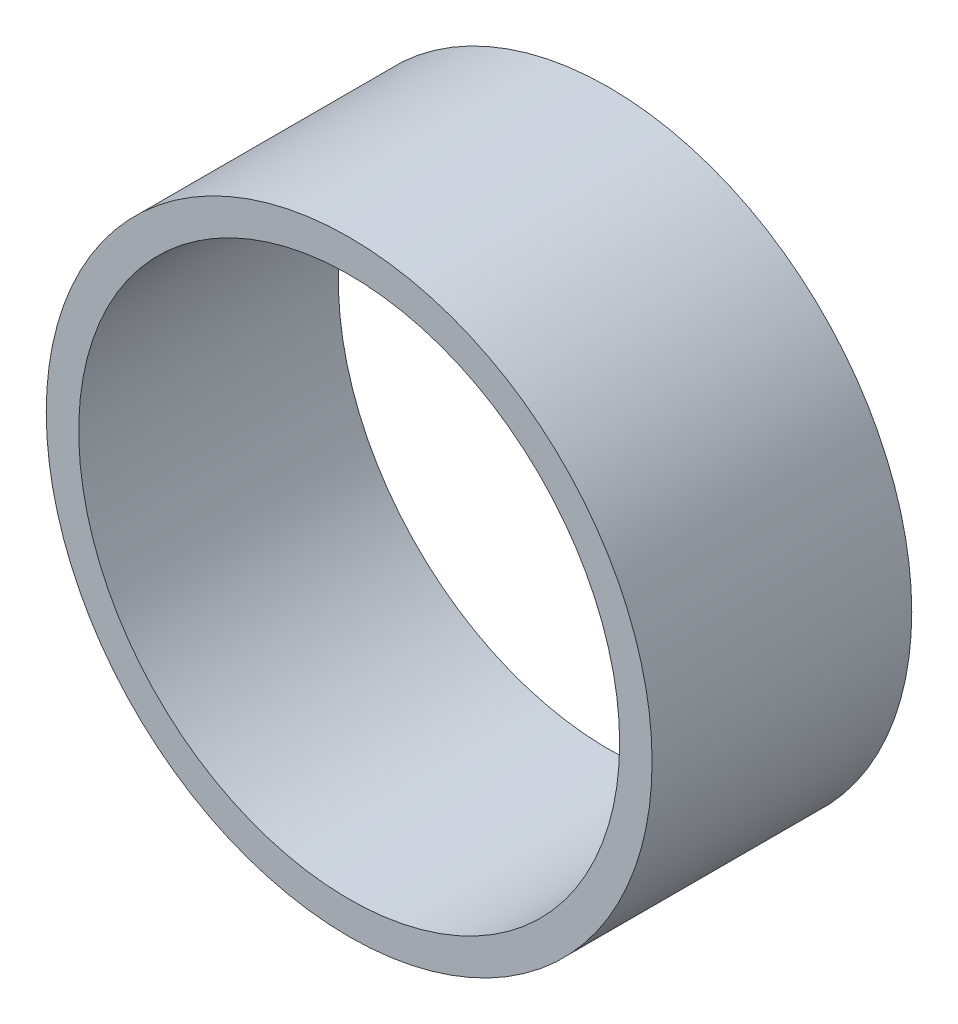
ISO-10303-21;
HEADER;
FILE_DESCRIPTION(('STEP AP214'),'2;1');
FILE_NAME('part.step','',(''),(''),'','','');
FILE_SCHEMA(('AUTOMOTIVE_DESIGN { 1 0 10303 214 1 1 1 1 }'));
ENDSEC;
DATA;
#1=APPLICATION_CONTEXT('core data for automotive mechanical design processes');
#2=APPLICATION_PROTOCOL_DEFINITION('international standard','automotive_design',2000,#1);
#3=PRODUCT_CONTEXT('',#1,'mechanical');
#4=PRODUCT('Part','Part','',(#3));
#5=PRODUCT_RELATED_PRODUCT_CATEGORY('part','',(#4));
#6=PRODUCT_DEFINITION_FORMATION('','',#4);
#7=PRODUCT_DEFINITION_CONTEXT('part definition',#1,'design');
#8=PRODUCT_DEFINITION('design','',#6,#7);
#9=PRODUCT_DEFINITION_SHAPE('','',#8);
#10=(LENGTH_UNIT() NAMED_UNIT(*) SI_UNIT(.MILLI.,.METRE.));
#11=(NAMED_UNIT(*) PLANE_ANGLE_UNIT() SI_UNIT($,.RADIAN.));
#12=(NAMED_UNIT(*) SI_UNIT($,.STERADIAN.) SOLID_ANGLE_UNIT());
#13=UNCERTAINTY_MEASURE_WITH_UNIT(LENGTH_MEASURE(1.E-05),#10,'distance_accuracy_value','');
#14=(GEOMETRIC_REPRESENTATION_CONTEXT(3) GLOBAL_UNCERTAINTY_ASSIGNED_CONTEXT((#13)) GLOBAL_UNIT_ASSIGNED_CONTEXT((#10,
#11,#12)) REPRESENTATION_CONTEXT('',''));
#15=CARTESIAN_POINT('',(0.,0.,0.));
#16=DIRECTION('',(0.,0.,1.));
#17=DIRECTION('',(1.,0.,0.));
#18=AXIS2_PLACEMENT_3D('',#15,#16,#17);
#19=CARTESIAN_POINT('',(0.,0.,12.));
#20=DIRECTION('',(0.,0.,1.));
#21=DIRECTION('',(1.,0.,0.));
#22=AXIS2_PLACEMENT_3D('',#19,#20,#21);
#23=PLANE('',#22);
#24=CARTESIAN_POINT('',(0.,0.,12.));
#25=DIRECTION('',(0.,0.,1.));
#26=DIRECTION('',(1.,0.,0.));
#27=AXIS2_PLACEMENT_3D('',#24,#25,#26);
#28=CIRCLE('',#27,14.);
#29=CARTESIAN_POINT('',(14.,0.,12.));
#30=VERTEX_POINT('',#29);
#31=EDGE_CURVE('E10',#30,#30,#28,.T.);
#32=ORIENTED_EDGE('',*,*,#31,.T.);
#33=EDGE_LOOP('',(#32));
#34=FACE_BOUND('',#33,.T.);
#35=CARTESIAN_POINT('',(0.,0.,12.));
#36=DIRECTION('',(0.,0.,1.));
#37=DIRECTION('',(1.,0.,0.));
#38=AXIS2_PLACEMENT_3D('',#35,#36,#37);
#39=CIRCLE('',#38,12.5);
#40=CARTESIAN_POINT('',(12.5,0.,12.));
#41=VERTEX_POINT('',#40);
#42=EDGE_CURVE('E46',#41,#41,#39,.T.);
#43=ORIENTED_EDGE('',*,*,#42,.F.);
#44=EDGE_LOOP('',(#43));
#45=FACE_BOUND('',#44,.T.);
#46=ADVANCED_FACE('F35',(#34,#45),#23,.T.);
#47=CARTESIAN_POINT('',(0.,0.,0.));
#48=DIRECTION('',(0.,0.,1.));
#49=DIRECTION('',(1.,0.,0.));
#50=AXIS2_PLACEMENT_3D('',#47,#48,#49);
#51=PLANE('',#50);
#52=CARTESIAN_POINT('',(0.,0.,0.));
#53=DIRECTION('',(0.,0.,1.));
#54=DIRECTION('',(1.,0.,0.));
#55=AXIS2_PLACEMENT_3D('',#52,#53,#54);
#56=CIRCLE('',#55,14.);
#57=CARTESIAN_POINT('',(14.,0.,0.));
#58=VERTEX_POINT('',#57);
#59=EDGE_CURVE('E39',#58,#58,#56,.T.);
#60=ORIENTED_EDGE('',*,*,#59,.F.);
#61=EDGE_LOOP('',(#60));
#62=FACE_BOUND('',#61,.T.);
#63=CARTESIAN_POINT('',(0.,0.,0.));
#64=DIRECTION('',(0.,0.,1.));
#65=DIRECTION('',(1.,0.,0.));
#66=AXIS2_PLACEMENT_3D('',#63,#64,#65);
#67=CIRCLE('',#66,12.5);
#68=CARTESIAN_POINT('',(12.5,0.,0.));
#69=VERTEX_POINT('',#68);
#70=EDGE_CURVE('E48',#69,#69,#67,.T.);
#71=ORIENTED_EDGE('',*,*,#70,.T.);
#72=EDGE_LOOP('',(#71));
#73=FACE_BOUND('',#72,.T.);
#74=ADVANCED_FACE('F58',(#62,#73),#51,.F.);
#75=CARTESIAN_POINT('',(0.,0.,12.));
#76=DIRECTION('',(0.,0.,-1.));
#77=DIRECTION('',(-1.,0.,0.));
#78=AXIS2_PLACEMENT_3D('',#75,#76,#77);
#79=CYLINDRICAL_SURFACE('',#78,14.);
#80=ORIENTED_EDGE('',*,*,#31,.F.);
#81=EDGE_LOOP('',(#80));
#82=FACE_BOUND('',#81,.T.);
#83=ORIENTED_EDGE('',*,*,#59,.T.);
#84=EDGE_LOOP('',(#83));
#85=FACE_BOUND('',#84,.T.);
#86=ADVANCED_FACE('F37',(#82,#85),#79,.T.);
#87=CARTESIAN_POINT('',(0.,0.,12.));
#88=DIRECTION('',(0.,0.,-1.));
#89=DIRECTION('',(-1.,0.,0.));
#90=AXIS2_PLACEMENT_3D('',#87,#88,#89);
#91=CYLINDRICAL_SURFACE('',#90,12.5);
#92=ORIENTED_EDGE('',*,*,#42,.T.);
#93=EDGE_LOOP('',(#92));
#94=FACE_BOUND('',#93,.T.);
#95=ORIENTED_EDGE('',*,*,#70,.F.);
#96=EDGE_LOOP('',(#95));
#97=FACE_BOUND('',#96,.T.);
#98=ADVANCED_FACE('F54',(#94,#97),#91,.F.);
#99=CLOSED_SHELL('',(#46,#74,#86,#98));
#100=MANIFOLD_SOLID_BREP('B2',#99);
#101=ADVANCED_BREP_SHAPE_REPRESENTATION('',(#18,#100),#14);
#102=SHAPE_DEFINITION_REPRESENTATION(#9,#101);
ENDSEC;
END-ISO-10303-21;
